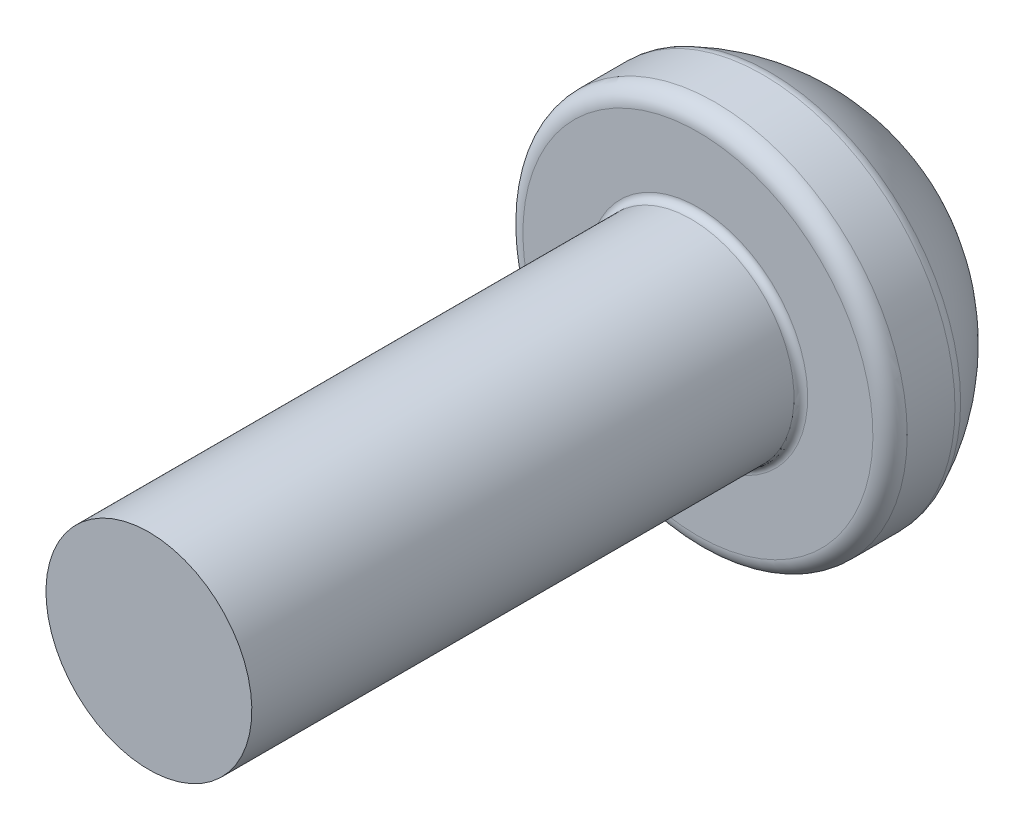
ISO-10303-21;
HEADER;
FILE_DESCRIPTION(('STEP AP214'),'2;1');
FILE_NAME('part.step','',(''),(''),'','','');
FILE_SCHEMA(('AUTOMOTIVE_DESIGN { 1 0 10303 214 1 1 1 1 }'));
ENDSEC;
DATA;
#1=APPLICATION_CONTEXT('core data for automotive mechanical design processes');
#2=APPLICATION_PROTOCOL_DEFINITION('international standard','automotive_design',2000,#1);
#3=PRODUCT_CONTEXT('',#1,'mechanical');
#4=PRODUCT('Part','Part','',(#3));
#5=PRODUCT_RELATED_PRODUCT_CATEGORY('part','',(#4));
#6=PRODUCT_DEFINITION_FORMATION('','',#4);
#7=PRODUCT_DEFINITION_CONTEXT('part definition',#1,'design');
#8=PRODUCT_DEFINITION('design','',#6,#7);
#9=PRODUCT_DEFINITION_SHAPE('','',#8);
#10=(LENGTH_UNIT() NAMED_UNIT(*) SI_UNIT(.MILLI.,.METRE.));
#11=(NAMED_UNIT(*) PLANE_ANGLE_UNIT() SI_UNIT($,.RADIAN.));
#12=(NAMED_UNIT(*) SI_UNIT($,.STERADIAN.) SOLID_ANGLE_UNIT());
#13=UNCERTAINTY_MEASURE_WITH_UNIT(LENGTH_MEASURE(1.E-05),#10,'distance_accuracy_value','');
#14=(GEOMETRIC_REPRESENTATION_CONTEXT(3) GLOBAL_UNCERTAINTY_ASSIGNED_CONTEXT((#13)) GLOBAL_UNIT_ASSIGNED_CONTEXT((#10,
#11,#12)) REPRESENTATION_CONTEXT('',''));
#15=CARTESIAN_POINT('',(0.,0.,0.));
#16=DIRECTION('',(0.,0.,1.));
#17=DIRECTION('',(1.,0.,0.));
#18=AXIS2_PLACEMENT_3D('',#15,#16,#17);
#19=CARTESIAN_POINT('',(0.,0.,7.99999999999996));
#20=DIRECTION('',(0.,0.,1.));
#21=DIRECTION('',(0.,-1.00000000000001,0.));
#22=AXIS2_PLACEMENT_3D('',#19,#20,#21);
#23=PLANE('',#22);
#24=CARTESIAN_POINT('',(0.,0.,7.99999999999996));
#25=DIRECTION('',(0.,0.,-1.));
#26=DIRECTION('',(0.,1.00000000000001,0.));
#27=AXIS2_PLACEMENT_3D('',#24,#25,#26);
#28=CIRCLE('',#27,1.5);
#29=CARTESIAN_POINT('',(0.,1.49999999999995,7.99999999999996));
#30=VERTEX_POINT('',#29);
#31=EDGE_CURVE('E264',#30,#30,#28,.T.);
#32=ORIENTED_EDGE('',*,*,#31,.F.);
#33=EDGE_LOOP('',(#32));
#34=FACE_BOUND('',#33,.T.);
#35=ADVANCED_FACE('F32',(#34),#23,.T.);
#36=CARTESIAN_POINT('',(0.,0.,-2.4));
#37=DIRECTION('',(0.,0.,-1.));
#38=DIRECTION('',(0.,1.00000000000001,0.));
#39=AXIS2_PLACEMENT_3D('',#36,#37,#38);
#40=CYLINDRICAL_SURFACE('',#39,1.5);
#41=CARTESIAN_POINT('',(0.,0.,0.0999999999999994));
#42=DIRECTION('',(0.,0.,1.));
#43=DIRECTION('',(0.,-1.00000000000001,0.));
#44=AXIS2_PLACEMENT_3D('',#41,#42,#43);
#45=CIRCLE('',#44,1.5);
#46=CARTESIAN_POINT('',(0.,-1.50000000000001,0.0999999999999975));
#47=VERTEX_POINT('',#46);
#48=EDGE_CURVE('E270',#47,#47,#45,.T.);
#49=ORIENTED_EDGE('',*,*,#48,.T.);
#50=EDGE_LOOP('',(#49));
#51=FACE_BOUND('',#50,.T.);
#52=ORIENTED_EDGE('',*,*,#31,.T.);
#53=EDGE_LOOP('',(#52));
#54=FACE_BOUND('',#53,.T.);
#55=ADVANCED_FACE('F305',(#51,#54),#40,.T.);
#56=CARTESIAN_POINT('',(0.,1.5,0.));
#57=DIRECTION('',(0.,0.,1.));
#58=DIRECTION('',(0.,-1.00000000000001,0.));
#59=AXIS2_PLACEMENT_3D('',#56,#57,#58);
#60=PLANE('',#59);
#61=CARTESIAN_POINT('',(0.,0.,0.));
#62=DIRECTION('',(0.,0.,1.));
#63=DIRECTION('',(0.,-1.00000000000001,0.));
#64=AXIS2_PLACEMENT_3D('',#61,#62,#63);
#65=CIRCLE('',#64,2.55);
#66=CARTESIAN_POINT('',(0.,-2.55000000000001,0.));
#67=VERTEX_POINT('',#66);
#68=EDGE_CURVE('E11',#67,#67,#65,.T.);
#69=ORIENTED_EDGE('',*,*,#68,.T.);
#70=EDGE_LOOP('',(#69));
#71=FACE_BOUND('',#70,.T.);
#72=CARTESIAN_POINT('',(0.,0.,0.));
#73=DIRECTION('',(0.,0.,1.));
#74=DIRECTION('',(0.,-1.00000000000001,0.));
#75=AXIS2_PLACEMENT_3D('',#72,#73,#74);
#76=CIRCLE('',#75,1.6);
#77=CARTESIAN_POINT('',(0.,-1.60000000000001,0.));
#78=VERTEX_POINT('',#77);
#79=EDGE_CURVE('E267',#78,#78,#76,.F.);
#80=ORIENTED_EDGE('',*,*,#79,.T.);
#81=EDGE_LOOP('',(#80));
#82=FACE_BOUND('',#81,.T.);
#83=ADVANCED_FACE('F310',(#71,#82),#60,.T.);
#84=CARTESIAN_POINT('',(0.,0.,-2.4));
#85=DIRECTION('',(0.,0.,-1.));
#86=DIRECTION('',(0.,1.00000000000001,0.));
#87=AXIS2_PLACEMENT_3D('',#84,#85,#86);
#88=CYLINDRICAL_SURFACE('',#87,2.8);
#89=CARTESIAN_POINT('',(0.,0.,-0.945424841825027));
#90=DIRECTION('',(0.,0.,1.));
#91=DIRECTION('',(0.,-1.00000000000001,0.));
#92=AXIS2_PLACEMENT_3D('',#89,#90,#91);
#93=CIRCLE('',#92,2.8);
#94=CARTESIAN_POINT('',(0.,-2.80000000000004,-0.94542484182503));
#95=VERTEX_POINT('',#94);
#96=EDGE_CURVE('E39',#95,#95,#93,.T.);
#97=ORIENTED_EDGE('',*,*,#96,.T.);
#98=EDGE_LOOP('',(#97));
#99=FACE_BOUND('',#98,.T.);
#100=CARTESIAN_POINT('',(0.,0.,-0.25));
#101=DIRECTION('',(0.,0.,1.));
#102=DIRECTION('',(0.,-1.00000000000001,0.));
#103=AXIS2_PLACEMENT_3D('',#100,#101,#102);
#104=CIRCLE('',#103,2.8);
#105=CARTESIAN_POINT('',(0.,-2.80000000000002,-0.250000000000004));
#106=VERTEX_POINT('',#105);
#107=EDGE_CURVE('E276',#106,#106,#104,.F.);
#108=ORIENTED_EDGE('',*,*,#107,.T.);
#109=EDGE_LOOP('',(#108));
#110=FACE_BOUND('',#109,.T.);
#111=ADVANCED_FACE('F281',(#99,#110),#88,.T.);
#112=CARTESIAN_POINT('',(0.,0.,0.253));
#113=DIRECTION('',(0.,0.,-1.));
#114=DIRECTION('',(0.,1.00000000000001,0.));
#115=AXIS2_PLACEMENT_3D('',#112,#113,#114);
#116=SPHERICAL_SURFACE('',#115,3.06757379699332);
#117=CARTESIAN_POINT('',(0.,0.,-1.05175966463463));
#118=DIRECTION('',(0.,0.,1.));
#119=DIRECTION('',(0.,-1.00000000000001,0.));
#120=AXIS2_PLACEMENT_3D('',#117,#118,#119);
#121=CIRCLE('',#120,2.77625849256558);
#122=CARTESIAN_POINT('',(0.,2.7762584925656,-1.05175966463463));
#123=VERTEX_POINT('',#122);
#124=EDGE_CURVE('E273',#123,#123,#121,.F.);
#125=CARTESIAN_POINT('',(0.,0.,-2.4));
#126=DIRECTION('',(0.,0.,-1.));
#127=DIRECTION('',(0.,1.00000000000001,0.));
#128=AXIS2_PLACEMENT_3D('',#125,#126,#127);
#129=CIRCLE('',#128,1.54);
#130=CARTESIAN_POINT('',(0.,1.54,-2.4));
#131=VERTEX_POINT('',#130);
#132=EDGE_CURVE('E260',#131,#131,#129,.T.);
#133=CARTESIAN_POINT('',(0.,2.7762584925656,-1.05175966463463));
#134=CARTESIAN_POINT('',(0.,2.7680287356093,-1.06927093928298));
#135=CARTESIAN_POINT('',(0.,2.75963325856511,-1.08670432952202));
#136=CARTESIAN_POINT('',(0.,2.74251396302795,-1.12140914487731));
#137=CARTESIAN_POINT('',(0.,2.73379014453497,-1.13868056999356));
#138=CARTESIAN_POINT('',(0.,2.71601726482718,-1.17305525879907));
#139=CARTESIAN_POINT('',(0.,2.70696820361238,-1.19015852248834));
#140=CARTESIAN_POINT('',(0.,2.68854808514227,-1.22419076788491));
#141=CARTESIAN_POINT('',(0.,2.67917702788696,-1.24111974959222));
#142=CARTESIAN_POINT('',(0.,2.66011627086748,-1.27479736870806));
#143=CARTESIAN_POINT('',(0.,2.65042657110331,-1.29154600611661));
#144=CARTESIAN_POINT('',(0.,2.63073199894965,-1.32485694000622));
#145=CARTESIAN_POINT('',(0.,2.62072712656015,-1.34141923648729));
#146=CARTESIAN_POINT('',(0.,2.60040579128122,-1.37435155831383));
#147=CARTESIAN_POINT('',(0.,2.59008932839178,-1.39072158365931));
#148=CARTESIAN_POINT('',(0.,2.56914850596594,-1.4232635019295));
#149=CARTESIAN_POINT('',(0.,2.55852414642955,-1.43943539485421));
#150=CARTESIAN_POINT('',(0.,2.53697133476197,-1.47157525791774));
#151=CARTESIAN_POINT('',(0.,2.52604288263079,-1.48754322805656));
#152=CARTESIAN_POINT('',(0.,2.50388579871807,-1.51926952820363));
#153=CARTESIAN_POINT('',(0.,2.49265716693654,-1.53502785821189));
#154=CARTESIAN_POINT('',(0.,2.46990374414404,-1.56632923581349));
#155=CARTESIAN_POINT('',(0.,2.45837895313307,-1.58187228340683));
#156=CARTESIAN_POINT('',(0.,2.43503733834351,-1.6127375309767));
#157=CARTESIAN_POINT('',(0.,2.42322051456493,-1.62805973095323));
#158=CARTESIAN_POINT('',(0.,2.39929906526432,-1.65847779716218));
#159=CARTESIAN_POINT('',(0.,2.3871944397423,-1.67357366339459));
#160=CARTESIAN_POINT('',(0.,2.36270172102674,-1.703533657027));
#161=CARTESIAN_POINT('',(0.,2.35031362783321,-1.718397784427));
#162=CARTESIAN_POINT('',(0.,2.32525840934238,-1.74788897828059));
#163=CARTESIAN_POINT('',(0.,2.31259128404508,-1.76251604473418));
#164=CARTESIAN_POINT('',(0.,2.28698253682217,-1.79152787946083));
#165=CARTESIAN_POINT('',(0.,2.27404091489656,-1.80591264773389));
#166=CARTESIAN_POINT('',(0.,2.24788780817623,-1.83443473562045));
#167=CARTESIAN_POINT('',(0.,2.23467632338152,-1.84857205523394));
#168=CARTESIAN_POINT('',(0.,2.20798822130683,-1.87659418392154));
#169=CARTESIAN_POINT('',(0.,2.19451160402686,-1.89047899299565));
#170=CARTESIAN_POINT('',(0.,2.16729806229643,-1.91799112913626));
#171=CARTESIAN_POINT('',(0.,2.15356113784597,-1.93161845620276));
#172=CARTESIAN_POINT('',(0.,2.12583190029255,-1.95861074905163));
#173=CARTESIAN_POINT('',(0.,2.11183958718959,-1.971975714834));
#174=CARTESIAN_POINT('',(0.,2.08360458229128,-1.99843849977674));
#175=CARTESIAN_POINT('',(0.,2.06936189049592,-2.01153631893711));
#176=CARTESIAN_POINT('',(0.,2.04063122782129,-2.03746012095012));
#177=CARTESIAN_POINT('',(0.,2.026143256942,-2.05028610380276));
#178=CARTESIAN_POINT('',(0.,1.99692722353021,-2.07566164084562));
#179=CARTESIAN_POINT('',(0.,1.98219916099771,-2.08821119503583));
#180=CARTESIAN_POINT('',(0.,1.95250821767573,-2.11302938137545));
#181=CARTESIAN_POINT('',(0.,1.93754533688625,-2.12529801352486));
#182=CARTESIAN_POINT('',(0.,1.90739011452163,-2.1495499629859));
#183=CARTESIAN_POINT('',(0.,1.89219777294648,-2.16153328029752));
#184=CARTESIAN_POINT('',(0.,1.86158906864721,-2.18521030945437));
#185=CARTESIAN_POINT('',(0.,1.84617270592309,-2.1969040212996));
#186=CARTESIAN_POINT('',(0.,1.81512147914839,-2.21999765254702));
#187=CARTESIAN_POINT('',(0.,1.79948661509781,-2.23139757194922));
#188=CARTESIAN_POINT('',(0.,1.76800398382114,-2.25389953668146));
#189=CARTESIAN_POINT('',(0.,1.75215621659505,-2.2650015820115));
#190=CARTESIAN_POINT('',(0.,1.72025345299826,-2.2869038230465));
#191=CARTESIAN_POINT('',(0.,1.70419845662756,-2.29770401875144));
#192=CARTESIAN_POINT('',(0.,1.67188698427809,-2.31899869521752));
#193=CARTESIAN_POINT('',(0.,1.65563050829932,-2.32949317597865));
#194=CARTESIAN_POINT('',(0.,1.62292189353214,-2.350172658651));
#195=CARTESIAN_POINT('',(0.,1.60646975474373,-2.36035766056221));
#196=CARTESIAN_POINT('',(0.,1.57337571941818,-2.38041456247664));
#197=CARTESIAN_POINT('',(0.,1.55673382288104,-2.39028646247984));
#198=CARTESIAN_POINT('',(0.,1.54,-2.4));
#199=B_SPLINE_CURVE_WITH_KNOTS('',3,(#133,#134,#135,#136,#137,#138,#139,#140,#141,#142,#143,
#144,#145,#146,#147,#148,#149,#150,#151,#152,#153,#154,#155,#156,#157,#158,#159,#160,#161,#162,
#163,#164,#165,#166,#167,#168,#169,#170,#171,#172,#173,#174,#175,#176,#177,#178,#179,#180,#181,
#182,#183,#184,#185,#186,#187,#188,#189,#190,#191,#192,#193,#194,#195,#196,#197,#198),
.UNSPECIFIED.,.F.,.F.,(4,2,2,2,2,2,2,2,2,2,2,2,2,2,2,2,2,2,2,2,2,2,2,2,2,2,2,2,2,2,2,2,4),(0.,
0.0580453449347516,0.116090689869504,0.174136034804255,0.232181379739007,0.290226724673759,
0.34827206960851,0.406317414543262,0.464362759478013,0.522408104412765,0.580453449347517,
0.638498794282269,0.696544139217021,0.754589484151772,0.812634829086524,0.870680174021276,
0.928725518956028,0.986770863890779,1.04481620882553,1.10286155376028,1.16090689869503,
1.21895224362979,1.27699758856454,1.33504293349929,1.39308827843404,1.45113362336879,
1.50917896830355,1.5672243132383,1.62526965817305,1.6833150031078,1.74136034804255,
1.7994056929773,1.85745103791206),.UNSPECIFIED.);
#200=EDGE_CURVE('BSEAM292',#123,#131,#199,.T.);
#201=ORIENTED_EDGE('',*,*,#124,.T.);
#202=ORIENTED_EDGE('',*,*,#132,.F.);
#203=ORIENTED_EDGE('',*,*,#200,.T.);
#204=ORIENTED_EDGE('',*,*,#200,.F.);
#205=EDGE_LOOP('',(#201,#203,#202,#204));
#206=FACE_BOUND('',#205,.T.);
#207=ADVANCED_FACE('F292',(#206),#116,.T.);
#208=CARTESIAN_POINT('',(0.,0.,-2.4));
#209=DIRECTION('',(0.,0.,-1.));
#210=DIRECTION('',(0.,1.00000000000001,0.));
#211=AXIS2_PLACEMENT_3D('',#208,#209,#210);
#212=PLANE('',#211);
#213=CARTESIAN_POINT('',(0.,0.,-2.4));
#214=DIRECTION('',(0.,0.,-1.));
#215=DIRECTION('',(0.,1.00000000000001,0.));
#216=AXIS2_PLACEMENT_3D('',#213,#214,#215);
#217=CIRCLE('',#216,1.4);
#218=CARTESIAN_POINT('',(0.217707917147425,-1.38296900283824,-2.40000000000004));
#219=VERTEX_POINT('',#218);
#220=CARTESIAN_POINT('',(-0.217707917147342,-1.38296900283824,-2.40000000000004));
#221=VERTEX_POINT('',#220);
#222=EDGE_CURVE('E183',#219,#221,#217,.T.);
#223=ORIENTED_EDGE('',*,*,#222,.F.);
#224=CARTESIAN_POINT('',(0.807500000000044,-1.39863102711191,-2.40000000000004));
#225=DIRECTION('',(0.,0.,1.));
#226=DIRECTION('',(0.,1.00000000000001,0.));
#227=AXIS2_PLACEMENT_3D('',#224,#225,#226);
#228=CIRCLE('',#227,0.59);
#229=CARTESIAN_POINT('',(1.08883233053075,-0.880025088273756,-2.40000000000003));
#230=VERTEX_POINT('',#229);
#231=EDGE_CURVE('E181',#230,#219,#228,.T.);
#232=ORIENTED_EDGE('',*,*,#231,.F.);
#233=CARTESIAN_POINT('',(0.,0.,-2.4));
#234=DIRECTION('',(0.,0.,-1.));
#235=DIRECTION('',(0.,1.00000000000001,0.));
#236=AXIS2_PLACEMENT_3D('',#233,#234,#235);
#237=CIRCLE('',#236,1.4);
#238=CARTESIAN_POINT('',(1.30654024767804,-0.502943914564513,-2.40000000000002));
#239=VERTEX_POINT('',#238);
#240=EDGE_CURVE('E178',#239,#230,#237,.T.);
#241=ORIENTED_EDGE('',*,*,#240,.F.);
#242=CARTESIAN_POINT('',(1.61500000000006,0.,-2.40000000000003));
#243=DIRECTION('',(0.,0.,1.));
#244=DIRECTION('',(0.,1.00000000000001,0.));
#245=AXIS2_PLACEMENT_3D('',#242,#243,#244);
#246=CIRCLE('',#245,0.59);
#247=CARTESIAN_POINT('',(1.30654024767804,0.502943914564458,-2.40000000000003));
#248=VERTEX_POINT('',#247);
#249=EDGE_CURVE('E176',#248,#239,#246,.T.);
#250=ORIENTED_EDGE('',*,*,#249,.F.);
#251=CARTESIAN_POINT('',(0.,0.,-2.4));
#252=DIRECTION('',(0.,0.,-1.));
#253=DIRECTION('',(0.,1.00000000000001,0.));
#254=AXIS2_PLACEMENT_3D('',#251,#252,#253);
#255=CIRCLE('',#254,1.4);
#256=CARTESIAN_POINT('',(1.08883233053067,0.880025088273756,-2.40000000000001));
#257=VERTEX_POINT('',#256);
#258=EDGE_CURVE('E173',#257,#248,#255,.T.);
#259=ORIENTED_EDGE('',*,*,#258,.F.);
#260=CARTESIAN_POINT('',(0.807500000000017,1.39863102711188,-2.4));
#261=DIRECTION('',(0.,0.,1.));
#262=DIRECTION('',(0.,1.00000000000001,0.));
#263=AXIS2_PLACEMENT_3D('',#260,#261,#262);
#264=CIRCLE('',#263,0.59);
#265=CARTESIAN_POINT('',(0.217707917147397,1.38296900283821,-2.40000000000003));
#266=VERTEX_POINT('',#265);
#267=EDGE_CURVE('E168',#266,#257,#264,.T.);
#268=ORIENTED_EDGE('',*,*,#267,.F.);
#269=CARTESIAN_POINT('',(0.,0.,-2.4));
#270=DIRECTION('',(0.,0.,-1.));
#271=DIRECTION('',(0.,1.00000000000001,0.));
#272=AXIS2_PLACEMENT_3D('',#269,#270,#271);
#273=CIRCLE('',#272,1.4);
#274=CARTESIAN_POINT('',(-0.217707917147369,1.38296900283816,-2.4));
#275=VERTEX_POINT('',#274);
#276=EDGE_CURVE('E166',#275,#266,#273,.T.);
#277=ORIENTED_EDGE('',*,*,#276,.F.);
#278=CARTESIAN_POINT('',(-0.807499999999933,1.39863102711182,-2.40000000000003));
#279=DIRECTION('',(0.,0.,1.));
#280=DIRECTION('',(0.,1.00000000000001,0.));
#281=AXIS2_PLACEMENT_3D('',#278,#279,#280);
#282=CIRCLE('',#281,0.59);
#283=CARTESIAN_POINT('',(-1.08883233053059,0.880025088273645,-2.4));
#284=VERTEX_POINT('',#283);
#285=EDGE_CURVE('E147',#284,#275,#282,.T.);
#286=ORIENTED_EDGE('',*,*,#285,.F.);
#287=CARTESIAN_POINT('',(0.,0.,-2.4));
#288=DIRECTION('',(0.,0.,-1.));
#289=DIRECTION('',(0.,1.00000000000001,0.));
#290=AXIS2_PLACEMENT_3D('',#287,#288,#289);
#291=CIRCLE('',#290,1.4);
#292=CARTESIAN_POINT('',(-1.30654024767798,0.502943914564513,-2.40000000000004));
#293=VERTEX_POINT('',#292);
#294=EDGE_CURVE('E156',#293,#284,#291,.T.);
#295=ORIENTED_EDGE('',*,*,#294,.F.);
#296=CARTESIAN_POINT('',(-1.61500000000001,0.,-2.40000000000004));
#297=DIRECTION('',(0.,0.,1.));
#298=DIRECTION('',(0.,1.00000000000001,0.));
#299=AXIS2_PLACEMENT_3D('',#296,#297,#298);
#300=CIRCLE('',#299,0.59);
#301=CARTESIAN_POINT('',(-1.30654024767796,-0.502943914564596,-2.40000000000003));
#302=VERTEX_POINT('',#301);
#303=EDGE_CURVE('E159',#302,#293,#300,.T.);
#304=ORIENTED_EDGE('',*,*,#303,.F.);
#305=CARTESIAN_POINT('',(0.,0.,-2.4));
#306=DIRECTION('',(0.,0.,-1.));
#307=DIRECTION('',(0.,1.00000000000001,0.));
#308=AXIS2_PLACEMENT_3D('',#305,#306,#307);
#309=CIRCLE('',#308,1.4);
#310=CARTESIAN_POINT('',(-1.08883233053061,-0.880025088273784,-2.40000000000004));
#311=VERTEX_POINT('',#310);
#312=EDGE_CURVE('E188',#311,#302,#309,.T.);
#313=ORIENTED_EDGE('',*,*,#312,.F.);
#314=CARTESIAN_POINT('',(-0.807499999999961,-1.39863102711194,-2.40000000000003));
#315=DIRECTION('',(0.,0.,1.));
#316=DIRECTION('',(0.,1.00000000000001,0.));
#317=AXIS2_PLACEMENT_3D('',#314,#315,#316);
#318=CIRCLE('',#317,0.59);
#319=EDGE_CURVE('E186',#221,#311,#318,.T.);
#320=ORIENTED_EDGE('',*,*,#319,.F.);
#321=EDGE_LOOP('',(#223,#232,#241,#250,#259,#268,#277,#286,#295,#304,#313,#320));
#322=FACE_BOUND('',#321,.T.);
#323=ORIENTED_EDGE('',*,*,#132,.T.);
#324=EDGE_LOOP('',(#323));
#325=FACE_BOUND('',#324,.T.);
#326=ADVANCED_FACE('F163',(#322,#325),#212,.T.);
#327=CARTESIAN_POINT('',(0.,0.,0.0999999999999994));
#328=DIRECTION('',(0.,0.,1.));
#329=DIRECTION('',(0.,-1.00000000000001,0.));
#330=AXIS2_PLACEMENT_3D('',#327,#328,#329);
#331=TOROIDAL_SURFACE('',#330,1.6,0.1);
#332=ORIENTED_EDGE('',*,*,#48,.F.);
#333=EDGE_LOOP('',(#332));
#334=FACE_BOUND('',#333,.T.);
#335=ORIENTED_EDGE('',*,*,#79,.F.);
#336=EDGE_LOOP('',(#335));
#337=FACE_BOUND('',#336,.T.);
#338=ADVANCED_FACE('F288',(#334,#337),#331,.F.);
#339=CARTESIAN_POINT('',(0.,0.,-0.945424841825027));
#340=DIRECTION('',(0.,0.,1.));
#341=DIRECTION('',(0.,-1.00000000000001,0.));
#342=AXIS2_PLACEMENT_3D('',#339,#340,#341);
#343=TOROIDAL_SURFACE('',#342,2.55,0.25);
#344=ORIENTED_EDGE('',*,*,#96,.F.);
#345=EDGE_LOOP('',(#344));
#346=FACE_BOUND('',#345,.T.);
#347=ORIENTED_EDGE('',*,*,#124,.F.);
#348=EDGE_LOOP('',(#347));
#349=FACE_BOUND('',#348,.T.);
#350=ADVANCED_FACE('F284',(#346,#349),#343,.T.);
#351=CARTESIAN_POINT('',(0.,0.,-0.25));
#352=DIRECTION('',(0.,0.,1.));
#353=DIRECTION('',(0.,-1.00000000000001,0.));
#354=AXIS2_PLACEMENT_3D('',#351,#352,#353);
#355=TOROIDAL_SURFACE('',#354,2.55,0.25);
#356=ORIENTED_EDGE('',*,*,#68,.F.);
#357=EDGE_LOOP('',(#356));
#358=FACE_BOUND('',#357,.T.);
#359=ORIENTED_EDGE('',*,*,#107,.F.);
#360=EDGE_LOOP('',(#359));
#361=FACE_BOUND('',#360,.T.);
#362=ADVANCED_FACE('F287',(#358,#361),#355,.T.);
#363=CARTESIAN_POINT('',(-1.61499999999995,0.,-1.40000000000004));
#364=DIRECTION('',(0.,0.,-1.));
#365=DIRECTION('',(0.,1.00000000000001,0.));
#366=AXIS2_PLACEMENT_3D('',#363,#364,#365);
#367=CYLINDRICAL_SURFACE('',#366,0.59);
#368=CARTESIAN_POINT('',(-1.61499999999995,0.,-1.40000000000004));
#369=DIRECTION('',(0.,0.,1.));
#370=DIRECTION('',(0.,1.00000000000001,0.));
#371=AXIS2_PLACEMENT_3D('',#368,#369,#370);
#372=CIRCLE('',#371,0.59);
#373=CARTESIAN_POINT('',(-1.30654024767798,-0.502943914564596,-1.40000000000003));
#374=VERTEX_POINT('',#373);
#375=CARTESIAN_POINT('',(-1.02499999999994,0.,-1.40000000000004));
#376=VERTEX_POINT('',#375);
#377=EDGE_CURVE('E192',#374,#376,#372,.T.);
#378=ORIENTED_EDGE('',*,*,#377,.F.);
#379=DIRECTION('',(0.,0.,-1.));
#380=VECTOR('',#379,1.);
#381=CARTESIAN_POINT('',(-1.30654024767798,-0.502943914564596,-1.40000000000003));
#382=LINE('',#381,#380);
#383=EDGE_CURVE('E227',#374,#302,#382,.T.);
#384=ORIENTED_EDGE('',*,*,#383,.T.);
#385=ORIENTED_EDGE('',*,*,#303,.T.);
#386=DIRECTION('',(0.,0.,-1.));
#387=VECTOR('',#386,1.);
#388=CARTESIAN_POINT('',(-1.30654024767798,0.50294391456443,-1.40000000000004));
#389=LINE('',#388,#387);
#390=CARTESIAN_POINT('',(-1.30654024767798,0.50294391456443,-1.40000000000004));
#391=VERTEX_POINT('',#390);
#392=EDGE_CURVE('E46',#391,#293,#389,.T.);
#393=ORIENTED_EDGE('',*,*,#392,.F.);
#394=EDGE_CURVE('E191',#376,#391,#372,.T.);
#395=ORIENTED_EDGE('',*,*,#394,.F.);
#396=EDGE_LOOP('',(#378,#384,#385,#393,#395));
#397=FACE_BOUND('',#396,.T.);
#398=ADVANCED_FACE('F346',(#397),#367,.T.);
#399=CARTESIAN_POINT('',(-0.807499999999933,-1.39863102711199,-1.40000000000004));
#400=DIRECTION('',(0.,0.,-1.));
#401=DIRECTION('',(0.,1.00000000000001,0.));
#402=AXIS2_PLACEMENT_3D('',#399,#400,#401);
#403=CYLINDRICAL_SURFACE('',#402,0.59);
#404=CARTESIAN_POINT('',(-0.807499999999933,-1.39863102711199,-1.40000000000004));
#405=DIRECTION('',(0.,0.,1.));
#406=DIRECTION('',(0.,1.00000000000001,0.));
#407=AXIS2_PLACEMENT_3D('',#404,#405,#406);
#408=CIRCLE('',#407,0.59);
#409=CARTESIAN_POINT('',(-0.217707917147258,-1.3829690028383,-1.40000000000004));
#410=VERTEX_POINT('',#409);
#411=CARTESIAN_POINT('',(-0.512499999999888,-0.887676038879071,-1.40000000000003));
#412=VERTEX_POINT('',#411);
#413=EDGE_CURVE('E221',#410,#412,#408,.T.);
#414=ORIENTED_EDGE('',*,*,#413,.F.);
#415=DIRECTION('',(0.,0.,-1.));
#416=VECTOR('',#415,1.);
#417=CARTESIAN_POINT('',(-0.217707917147258,-1.3829690028383,-1.40000000000004));
#418=LINE('',#417,#416);
#419=EDGE_CURVE('E234',#410,#221,#418,.T.);
#420=ORIENTED_EDGE('',*,*,#419,.T.);
#421=ORIENTED_EDGE('',*,*,#319,.T.);
#422=DIRECTION('',(0.,0.,-1.));
#423=VECTOR('',#422,1.);
#424=CARTESIAN_POINT('',(-1.08883233053061,-0.880025088273811,-1.40000000000004));
#425=LINE('',#424,#423);
#426=CARTESIAN_POINT('',(-1.08883233053061,-0.880025088273811,-1.40000000000004));
#427=VERTEX_POINT('',#426);
#428=EDGE_CURVE('E231',#427,#311,#425,.T.);
#429=ORIENTED_EDGE('',*,*,#428,.F.);
#430=EDGE_CURVE('E220',#412,#427,#408,.T.);
#431=ORIENTED_EDGE('',*,*,#430,.F.);
#432=EDGE_LOOP('',(#414,#420,#421,#429,#431));
#433=FACE_BOUND('',#432,.T.);
#434=ADVANCED_FACE('F363',(#433),#403,.T.);
#435=CARTESIAN_POINT('',(0.8075000000001,-1.39863102711188,-1.40000000000002));
#436=DIRECTION('',(0.,0.,-1.));
#437=DIRECTION('',(0.,1.00000000000001,0.));
#438=AXIS2_PLACEMENT_3D('',#435,#436,#437);
#439=CYLINDRICAL_SURFACE('',#438,0.59);
#440=CARTESIAN_POINT('',(0.8075000000001,-1.39863102711188,-1.40000000000002));
#441=DIRECTION('',(0.,0.,1.));
#442=DIRECTION('',(0.,1.00000000000001,0.));
#443=AXIS2_PLACEMENT_3D('',#440,#441,#442);
#444=CIRCLE('',#443,0.59);
#445=CARTESIAN_POINT('',(1.08883233053075,-0.880025088273756,-1.40000000000003));
#446=VERTEX_POINT('',#445);
#447=CARTESIAN_POINT('',(0.51250000000011,-0.887676038879071,-1.40000000000004));
#448=VERTEX_POINT('',#447);
#449=EDGE_CURVE('E214',#446,#448,#444,.T.);
#450=ORIENTED_EDGE('',*,*,#449,.F.);
#451=DIRECTION('',(0.,0.,-1.));
#452=VECTOR('',#451,1.);
#453=CARTESIAN_POINT('',(1.08883233053075,-0.880025088273756,-1.40000000000003));
#454=LINE('',#453,#452);
#455=EDGE_CURVE('E240',#446,#230,#454,.T.);
#456=ORIENTED_EDGE('',*,*,#455,.T.);
#457=ORIENTED_EDGE('',*,*,#231,.T.);
#458=DIRECTION('',(0.,0.,-1.));
#459=VECTOR('',#458,1.);
#460=CARTESIAN_POINT('',(0.217707917147397,-1.3829690028383,-1.40000000000004));
#461=LINE('',#460,#459);
#462=CARTESIAN_POINT('',(0.217707917147397,-1.3829690028383,-1.40000000000004));
#463=VERTEX_POINT('',#462);
#464=EDGE_CURVE('E237',#463,#219,#461,.T.);
#465=ORIENTED_EDGE('',*,*,#464,.F.);
#466=EDGE_CURVE('E213',#448,#463,#444,.T.);
#467=ORIENTED_EDGE('',*,*,#466,.F.);
#468=EDGE_LOOP('',(#450,#456,#457,#465,#467));
#469=FACE_BOUND('',#468,.T.);
#470=ADVANCED_FACE('F371',(#469),#439,.T.);
#471=CARTESIAN_POINT('',(1.61500000000006,0.,-1.40000000000003));
#472=DIRECTION('',(0.,0.,-1.));
#473=DIRECTION('',(0.,1.00000000000001,0.));
#474=AXIS2_PLACEMENT_3D('',#471,#472,#473);
#475=CYLINDRICAL_SURFACE('',#474,0.59);
#476=CARTESIAN_POINT('',(1.61500000000006,0.,-1.40000000000003));
#477=DIRECTION('',(0.,0.,1.));
#478=DIRECTION('',(0.,1.00000000000001,0.));
#479=AXIS2_PLACEMENT_3D('',#476,#477,#478);
#480=CIRCLE('',#479,0.59);
#481=CARTESIAN_POINT('',(1.3065402476781,0.502943914564402,-1.4));
#482=VERTEX_POINT('',#481);
#483=CARTESIAN_POINT('',(1.02500000000011,0.,-1.40000000000003));
#484=VERTEX_POINT('',#483);
#485=EDGE_CURVE('E207',#482,#484,#480,.T.);
#486=ORIENTED_EDGE('',*,*,#485,.F.);
#487=DIRECTION('',(0.,0.,-1.));
#488=VECTOR('',#487,1.);
#489=CARTESIAN_POINT('',(1.3065402476781,0.502943914564402,-1.4));
#490=LINE('',#489,#488);
#491=EDGE_CURVE('E246',#482,#248,#490,.T.);
#492=ORIENTED_EDGE('',*,*,#491,.T.);
#493=ORIENTED_EDGE('',*,*,#249,.T.);
#494=DIRECTION('',(0.,0.,-1.));
#495=VECTOR('',#494,1.);
#496=CARTESIAN_POINT('',(1.30654024767807,-0.502943914564513,-1.4));
#497=LINE('',#496,#495);
#498=CARTESIAN_POINT('',(1.30654024767807,-0.502943914564513,-1.4));
#499=VERTEX_POINT('',#498);
#500=EDGE_CURVE('E243',#499,#239,#497,.T.);
#501=ORIENTED_EDGE('',*,*,#500,.F.);
#502=EDGE_CURVE('E206',#484,#499,#480,.T.);
#503=ORIENTED_EDGE('',*,*,#502,.F.);
#504=EDGE_LOOP('',(#486,#492,#493,#501,#503));
#505=FACE_BOUND('',#504,.T.);
#506=ADVANCED_FACE('F379',(#505),#475,.T.);
#507=CARTESIAN_POINT('',(0.807500000000044,1.39863102711182,-1.4));
#508=DIRECTION('',(0.,0.,-1.));
#509=DIRECTION('',(0.,1.00000000000001,0.));
#510=AXIS2_PLACEMENT_3D('',#507,#508,#509);
#511=CYLINDRICAL_SURFACE('',#510,0.59);
#512=CARTESIAN_POINT('',(0.807500000000044,1.39863102711182,-1.4));
#513=DIRECTION('',(0.,0.,1.));
#514=DIRECTION('',(0.,1.00000000000001,0.));
#515=AXIS2_PLACEMENT_3D('',#512,#513,#514);
#516=CIRCLE('',#515,0.59);
#517=CARTESIAN_POINT('',(0.217707917147481,1.38296900283819,-1.40000000000003));
#518=VERTEX_POINT('',#517);
#519=CARTESIAN_POINT('',(0.51250000000011,0.887676038879043,-1.40000000000001));
#520=VERTEX_POINT('',#519);
#521=EDGE_CURVE('E54',#518,#520,#516,.T.);
#522=ORIENTED_EDGE('',*,*,#521,.F.);
#523=DIRECTION('',(0.,0.,-1.));
#524=VECTOR('',#523,1.);
#525=CARTESIAN_POINT('',(0.217707917147481,1.38296900283819,-1.40000000000003));
#526=LINE('',#525,#524);
#527=EDGE_CURVE('E252',#518,#266,#526,.T.);
#528=ORIENTED_EDGE('',*,*,#527,.T.);
#529=ORIENTED_EDGE('',*,*,#267,.T.);
#530=DIRECTION('',(0.,0.,-1.));
#531=VECTOR('',#530,1.);
#532=CARTESIAN_POINT('',(1.08883233053067,0.8800250882737,-1.40000000000001));
#533=LINE('',#532,#531);
#534=CARTESIAN_POINT('',(1.08883233053067,0.8800250882737,-1.40000000000001));
#535=VERTEX_POINT('',#534);
#536=EDGE_CURVE('E249',#535,#257,#533,.T.);
#537=ORIENTED_EDGE('',*,*,#536,.F.);
#538=EDGE_CURVE('E201',#520,#535,#516,.T.);
#539=ORIENTED_EDGE('',*,*,#538,.F.);
#540=EDGE_LOOP('',(#522,#528,#529,#537,#539));
#541=FACE_BOUND('',#540,.T.);
#542=ADVANCED_FACE('F387',(#541),#511,.T.);
#543=CARTESIAN_POINT('',(-0.807499999999933,1.39863102711182,-1.40000000000003));
#544=DIRECTION('',(0.,0.,-1.));
#545=DIRECTION('',(0.,1.00000000000001,0.));
#546=AXIS2_PLACEMENT_3D('',#543,#544,#545);
#547=CYLINDRICAL_SURFACE('',#546,0.59);
#548=CARTESIAN_POINT('',(-0.807499999999933,1.39863102711182,-1.40000000000003));
#549=DIRECTION('',(0.,0.,1.));
#550=DIRECTION('',(0.,1.00000000000001,0.));
#551=AXIS2_PLACEMENT_3D('',#548,#549,#550);
#552=CIRCLE('',#551,0.59);
#553=CARTESIAN_POINT('',(-1.08883233053059,0.880025088273645,-1.4));
#554=VERTEX_POINT('',#553);
#555=CARTESIAN_POINT('',(-0.512499999999888,0.887676038878987,-1.40000000000001));
#556=VERTEX_POINT('',#555);
#557=EDGE_CURVE('E151',#554,#556,#552,.T.);
#558=ORIENTED_EDGE('',*,*,#557,.F.);
#559=DIRECTION('',(0.,0.,-1.));
#560=VECTOR('',#559,1.);
#561=CARTESIAN_POINT('',(-1.08883233053059,0.880025088273645,-1.4));
#562=LINE('',#561,#560);
#563=EDGE_CURVE('E143',#554,#284,#562,.T.);
#564=ORIENTED_EDGE('',*,*,#563,.T.);
#565=ORIENTED_EDGE('',*,*,#285,.T.);
#566=DIRECTION('',(0.,0.,-1.));
#567=VECTOR('',#566,1.);
#568=CARTESIAN_POINT('',(-0.217707917147369,1.38296900283816,-1.4));
#569=LINE('',#568,#567);
#570=CARTESIAN_POINT('',(-0.217707917147369,1.38296900283816,-1.4));
#571=VERTEX_POINT('',#570);
#572=EDGE_CURVE('E153',#571,#275,#569,.T.);
#573=ORIENTED_EDGE('',*,*,#572,.F.);
#574=EDGE_CURVE('E197',#556,#571,#552,.T.);
#575=ORIENTED_EDGE('',*,*,#574,.F.);
#576=EDGE_LOOP('',(#558,#564,#565,#573,#575));
#577=FACE_BOUND('',#576,.T.);
#578=ADVANCED_FACE('F144',(#577),#547,.T.);
#579=CARTESIAN_POINT('',(-0.807499999999933,0.,-1.40000000000003));
#580=DIRECTION('',(0.,0.,-1.));
#581=DIRECTION('',(0.,1.00000000000001,0.));
#582=AXIS2_PLACEMENT_3D('',#579,#580,#581);
#583=PLANE('',#582);
#584=CARTESIAN_POINT('',(1.11022302462516E-13,0.,-1.4));
#585=DIRECTION('',(0.,0.,-1.));
#586=DIRECTION('',(0.,1.00000000000001,0.));
#587=AXIS2_PLACEMENT_3D('',#584,#585,#586);
#588=CIRCLE('',#587,1.025);
#589=EDGE_CURVE('E492',#376,#556,#588,.T.);
#590=ORIENTED_EDGE('',*,*,#589,.F.);
#591=ORIENTED_EDGE('',*,*,#394,.T.);
#592=CARTESIAN_POINT('',(1.11022302462516E-13,0.,-1.4));
#593=DIRECTION('',(0.,0.,-1.));
#594=DIRECTION('',(0.,1.00000000000001,0.));
#595=AXIS2_PLACEMENT_3D('',#592,#593,#594);
#596=CIRCLE('',#595,1.4);
#597=EDGE_CURVE('E195',#391,#554,#596,.T.);
#598=ORIENTED_EDGE('',*,*,#597,.T.);
#599=ORIENTED_EDGE('',*,*,#557,.T.);
#600=EDGE_LOOP('',(#590,#591,#598,#599));
#601=FACE_BOUND('',#600,.T.);
#602=ADVANCED_FACE('F402',(#601),#583,.T.);
#603=EDGE_CURVE('E498',#412,#376,#588,.T.);
#604=ORIENTED_EDGE('',*,*,#603,.F.);
#605=ORIENTED_EDGE('',*,*,#430,.T.);
#606=CARTESIAN_POINT('',(1.11022302462516E-13,0.,-1.4));
#607=DIRECTION('',(0.,0.,-1.));
#608=DIRECTION('',(0.,1.00000000000001,0.));
#609=AXIS2_PLACEMENT_3D('',#606,#607,#608);
#610=CIRCLE('',#609,1.4);
#611=EDGE_CURVE('E224',#427,#374,#610,.T.);
#612=ORIENTED_EDGE('',*,*,#611,.T.);
#613=ORIENTED_EDGE('',*,*,#377,.T.);
#614=EDGE_LOOP('',(#604,#605,#612,#613));
#615=FACE_BOUND('',#614,.T.);
#616=ADVANCED_FACE('F409',(#615),#583,.T.);
#617=EDGE_CURVE('E499',#448,#412,#588,.T.);
#618=ORIENTED_EDGE('',*,*,#617,.F.);
#619=ORIENTED_EDGE('',*,*,#466,.T.);
#620=CARTESIAN_POINT('',(1.11022302462516E-13,0.,-1.4));
#621=DIRECTION('',(0.,0.,-1.));
#622=DIRECTION('',(0.,1.00000000000001,0.));
#623=AXIS2_PLACEMENT_3D('',#620,#621,#622);
#624=CIRCLE('',#623,1.4);
#625=EDGE_CURVE('E217',#463,#410,#624,.T.);
#626=ORIENTED_EDGE('',*,*,#625,.T.);
#627=ORIENTED_EDGE('',*,*,#413,.T.);
#628=EDGE_LOOP('',(#618,#619,#626,#627));
#629=FACE_BOUND('',#628,.T.);
#630=ADVANCED_FACE('F418',(#629),#583,.T.);
#631=EDGE_CURVE('E261',#484,#448,#588,.T.);
#632=ORIENTED_EDGE('',*,*,#631,.F.);
#633=ORIENTED_EDGE('',*,*,#502,.T.);
#634=CARTESIAN_POINT('',(1.11022302462516E-13,0.,-1.4));
#635=DIRECTION('',(0.,0.,-1.));
#636=DIRECTION('',(0.,1.00000000000001,0.));
#637=AXIS2_PLACEMENT_3D('',#634,#635,#636);
#638=CIRCLE('',#637,1.4);
#639=EDGE_CURVE('E210',#499,#446,#638,.T.);
#640=ORIENTED_EDGE('',*,*,#639,.T.);
#641=ORIENTED_EDGE('',*,*,#449,.T.);
#642=EDGE_LOOP('',(#632,#633,#640,#641));
#643=FACE_BOUND('',#642,.T.);
#644=ADVANCED_FACE('F425',(#643),#583,.T.);
#645=EDGE_CURVE('E257',#520,#484,#588,.T.);
#646=ORIENTED_EDGE('',*,*,#645,.F.);
#647=ORIENTED_EDGE('',*,*,#538,.T.);
#648=CARTESIAN_POINT('',(1.11022302462516E-13,0.,-1.4));
#649=DIRECTION('',(0.,0.,-1.));
#650=DIRECTION('',(0.,1.00000000000001,0.));
#651=AXIS2_PLACEMENT_3D('',#648,#649,#650);
#652=CIRCLE('',#651,1.4);
#653=EDGE_CURVE('E203',#535,#482,#652,.T.);
#654=ORIENTED_EDGE('',*,*,#653,.T.);
#655=ORIENTED_EDGE('',*,*,#485,.T.);
#656=EDGE_LOOP('',(#646,#647,#654,#655));
#657=FACE_BOUND('',#656,.T.);
#658=ADVANCED_FACE('F432',(#657),#583,.T.);
#659=EDGE_CURVE('E230',#556,#520,#588,.T.);
#660=ORIENTED_EDGE('',*,*,#659,.F.);
#661=ORIENTED_EDGE('',*,*,#574,.T.);
#662=CARTESIAN_POINT('',(1.11022302462516E-13,0.,-1.4));
#663=DIRECTION('',(0.,0.,-1.));
#664=DIRECTION('',(0.,1.00000000000001,0.));
#665=AXIS2_PLACEMENT_3D('',#662,#663,#664);
#666=CIRCLE('',#665,1.4);
#667=EDGE_CURVE('E199',#571,#518,#666,.T.);
#668=ORIENTED_EDGE('',*,*,#667,.T.);
#669=ORIENTED_EDGE('',*,*,#521,.T.);
#670=EDGE_LOOP('',(#660,#661,#668,#669));
#671=FACE_BOUND('',#670,.T.);
#672=ADVANCED_FACE('F412',(#671),#583,.T.);
#673=CARTESIAN_POINT('',(1.11022302462516E-13,0.,-1.4));
#674=DIRECTION('',(0.,0.,-1.));
#675=DIRECTION('',(0.,1.00000000000001,0.));
#676=AXIS2_PLACEMENT_3D('',#673,#674,#675);
#677=CYLINDRICAL_SURFACE('',#676,1.4);
#678=ORIENTED_EDGE('',*,*,#312,.T.);
#679=ORIENTED_EDGE('',*,*,#383,.F.);
#680=ORIENTED_EDGE('',*,*,#611,.F.);
#681=ORIENTED_EDGE('',*,*,#428,.T.);
#682=EDGE_LOOP('',(#678,#679,#680,#681));
#683=FACE_BOUND('',#682,.T.);
#684=ADVANCED_FACE('F445',(#683),#677,.F.);
#685=CARTESIAN_POINT('',(1.11022302462516E-13,0.,-1.4));
#686=DIRECTION('',(0.,0.,-1.));
#687=DIRECTION('',(0.,1.00000000000001,0.));
#688=AXIS2_PLACEMENT_3D('',#685,#686,#687);
#689=CYLINDRICAL_SURFACE('',#688,1.4);
#690=ORIENTED_EDGE('',*,*,#222,.T.);
#691=ORIENTED_EDGE('',*,*,#419,.F.);
#692=ORIENTED_EDGE('',*,*,#625,.F.);
#693=ORIENTED_EDGE('',*,*,#464,.T.);
#694=EDGE_LOOP('',(#690,#691,#692,#693));
#695=FACE_BOUND('',#694,.T.);
#696=ADVANCED_FACE('F451',(#695),#689,.F.);
#697=CARTESIAN_POINT('',(1.11022302462516E-13,0.,-1.4));
#698=DIRECTION('',(0.,0.,-1.));
#699=DIRECTION('',(0.,1.00000000000001,0.));
#700=AXIS2_PLACEMENT_3D('',#697,#698,#699);
#701=CYLINDRICAL_SURFACE('',#700,1.4);
#702=ORIENTED_EDGE('',*,*,#240,.T.);
#703=ORIENTED_EDGE('',*,*,#455,.F.);
#704=ORIENTED_EDGE('',*,*,#639,.F.);
#705=ORIENTED_EDGE('',*,*,#500,.T.);
#706=EDGE_LOOP('',(#702,#703,#704,#705));
#707=FACE_BOUND('',#706,.T.);
#708=ADVANCED_FACE('F459',(#707),#701,.F.);
#709=CARTESIAN_POINT('',(1.11022302462516E-13,0.,-1.4));
#710=DIRECTION('',(0.,0.,-1.));
#711=DIRECTION('',(0.,1.00000000000001,0.));
#712=AXIS2_PLACEMENT_3D('',#709,#710,#711);
#713=CYLINDRICAL_SURFACE('',#712,1.4);
#714=ORIENTED_EDGE('',*,*,#258,.T.);
#715=ORIENTED_EDGE('',*,*,#491,.F.);
#716=ORIENTED_EDGE('',*,*,#653,.F.);
#717=ORIENTED_EDGE('',*,*,#536,.T.);
#718=EDGE_LOOP('',(#714,#715,#716,#717));
#719=FACE_BOUND('',#718,.T.);
#720=ADVANCED_FACE('F467',(#719),#713,.F.);
#721=CARTESIAN_POINT('',(1.11022302462516E-13,0.,-1.4));
#722=DIRECTION('',(0.,0.,-1.));
#723=DIRECTION('',(0.,1.00000000000001,0.));
#724=AXIS2_PLACEMENT_3D('',#721,#722,#723);
#725=CYLINDRICAL_SURFACE('',#724,1.4);
#726=ORIENTED_EDGE('',*,*,#276,.T.);
#727=ORIENTED_EDGE('',*,*,#527,.F.);
#728=ORIENTED_EDGE('',*,*,#667,.F.);
#729=ORIENTED_EDGE('',*,*,#572,.T.);
#730=EDGE_LOOP('',(#726,#727,#728,#729));
#731=FACE_BOUND('',#730,.T.);
#732=ADVANCED_FACE('F475',(#731),#725,.F.);
#733=CARTESIAN_POINT('',(1.11022302462516E-13,0.,-1.4));
#734=DIRECTION('',(0.,0.,-1.));
#735=DIRECTION('',(0.,1.00000000000001,0.));
#736=AXIS2_PLACEMENT_3D('',#733,#734,#735);
#737=CYLINDRICAL_SURFACE('',#736,1.4);
#738=ORIENTED_EDGE('',*,*,#294,.T.);
#739=ORIENTED_EDGE('',*,*,#563,.F.);
#740=ORIENTED_EDGE('',*,*,#597,.F.);
#741=ORIENTED_EDGE('',*,*,#392,.T.);
#742=EDGE_LOOP('',(#738,#739,#740,#741));
#743=FACE_BOUND('',#742,.T.);
#744=ADVANCED_FACE('F157',(#743),#737,.F.);
#745=CARTESIAN_POINT('',(1.11022302462516E-13,0.,-1.4));
#746=DIRECTION('',(0.,0.,-1.));
#747=DIRECTION('',(0.,1.00000000000001,0.));
#748=AXIS2_PLACEMENT_3D('',#745,#746,#747);
#749=CONICAL_SURFACE('',#748,1.025,1.22173047639603);
#750=CARTESIAN_POINT('',(0.,0.,-1.02693050987715));
#751=VERTEX_POINT('',#750);
#752=VERTEX_LOOP('',#751);
#753=FACE_BOUND('',#752,.T.);
#754=ORIENTED_EDGE('',*,*,#645,.T.);
#755=ORIENTED_EDGE('',*,*,#631,.T.);
#756=ORIENTED_EDGE('',*,*,#617,.T.);
#757=ORIENTED_EDGE('',*,*,#603,.T.);
#758=ORIENTED_EDGE('',*,*,#589,.T.);
#759=ORIENTED_EDGE('',*,*,#659,.T.);
#760=EDGE_LOOP('',(#754,#755,#756,#757,#758,#759));
#761=FACE_BOUND('',#760,.T.);
#762=ADVANCED_FACE('F351',(#753,#761),#749,.F.);
#763=CLOSED_SHELL('',(#35,#55,#83,#111,#207,#326,#338,#350,#362,#398,#434,#470,#506,#542,#578,
#602,#616,#630,#644,#658,#672,#684,#696,#708,#720,#732,#744,#762));
#764=MANIFOLD_SOLID_BREP('B2',#763);
#765=ADVANCED_BREP_SHAPE_REPRESENTATION('',(#18,#764),#14);
#766=SHAPE_DEFINITION_REPRESENTATION(#9,#765);
ENDSEC;
END-ISO-10303-21;
